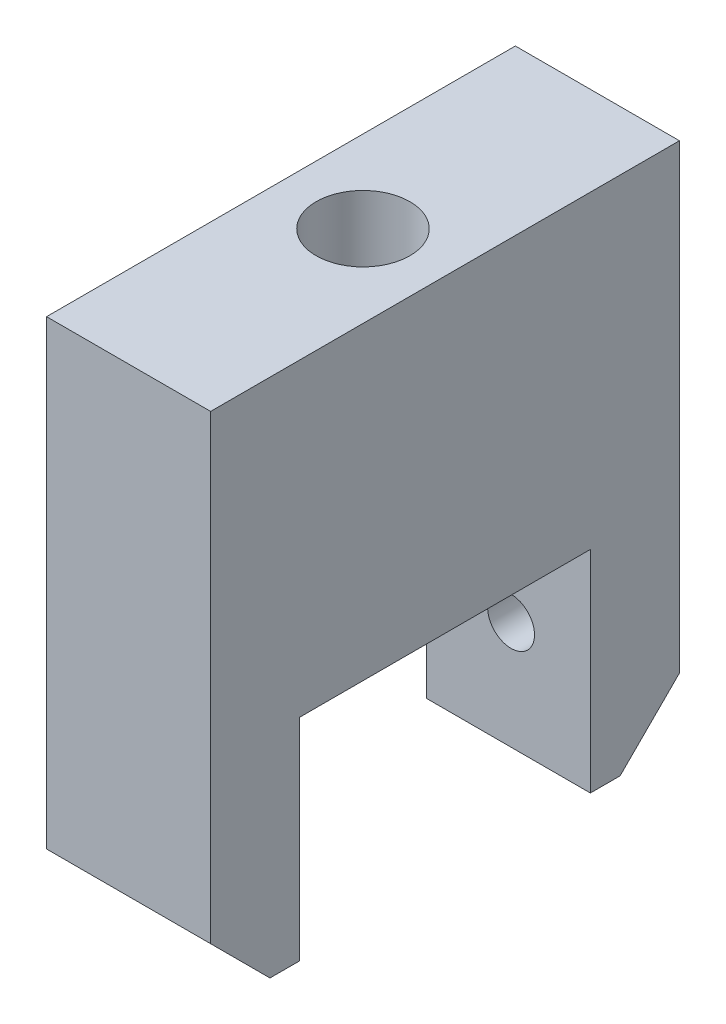
ISO-10303-21;
HEADER;
FILE_DESCRIPTION(('STEP AP214'),'2;1');
FILE_NAME('part.step','',(''),(''),'','','');
FILE_SCHEMA(('AUTOMOTIVE_DESIGN { 1 0 10303 214 1 1 1 1 }'));
ENDSEC;
DATA;
#1=APPLICATION_CONTEXT('core data for automotive mechanical design processes');
#2=APPLICATION_PROTOCOL_DEFINITION('international standard','automotive_design',2000,#1);
#3=PRODUCT_CONTEXT('',#1,'mechanical');
#4=PRODUCT('Part','Part','',(#3));
#5=PRODUCT_RELATED_PRODUCT_CATEGORY('part','',(#4));
#6=PRODUCT_DEFINITION_FORMATION('','',#4);
#7=PRODUCT_DEFINITION_CONTEXT('part definition',#1,'design');
#8=PRODUCT_DEFINITION('design','',#6,#7);
#9=PRODUCT_DEFINITION_SHAPE('','',#8);
#10=(LENGTH_UNIT() NAMED_UNIT(*) SI_UNIT(.MILLI.,.METRE.));
#11=(NAMED_UNIT(*) PLANE_ANGLE_UNIT() SI_UNIT($,.RADIAN.));
#12=(NAMED_UNIT(*) SI_UNIT($,.STERADIAN.) SOLID_ANGLE_UNIT());
#13=UNCERTAINTY_MEASURE_WITH_UNIT(LENGTH_MEASURE(1.E-05),#10,'distance_accuracy_value','');
#14=(GEOMETRIC_REPRESENTATION_CONTEXT(3) GLOBAL_UNCERTAINTY_ASSIGNED_CONTEXT((#13)) GLOBAL_UNIT_ASSIGNED_CONTEXT((#10,
#11,#12)) REPRESENTATION_CONTEXT('',''));
#15=CARTESIAN_POINT('',(0.,0.,0.));
#16=DIRECTION('',(0.,0.,1.));
#17=DIRECTION('',(1.,0.,0.));
#18=AXIS2_PLACEMENT_3D('',#15,#16,#17);
#19=CARTESIAN_POINT('',(5.461,0.508,0.));
#20=DIRECTION('',(0.,1.,0.));
#21=DIRECTION('',(0.,0.,1.));
#22=AXIS2_PLACEMENT_3D('',#19,#20,#21);
#23=PLANE('',#22);
#24=DIRECTION('',(1.,0.,0.));
#25=VECTOR('',#24,1.);
#26=CARTESIAN_POINT('',(4.95299999999999,0.508,-10.795));
#27=LINE('',#26,#25);
#28=CARTESIAN_POINT('',(0.507999999999993,0.508,-10.795));
#29=VERTEX_POINT('',#28);
#30=CARTESIAN_POINT('',(4.95299999999999,0.508,-10.795));
#31=VERTEX_POINT('',#30);
#32=EDGE_CURVE('E201',#29,#31,#27,.T.);
#33=ORIENTED_EDGE('',*,*,#32,.F.);
#34=DIRECTION('',(0.,0.,-1.));
#35=VECTOR('',#34,1.);
#36=CARTESIAN_POINT('',(0.508,0.508,0.));
#37=LINE('',#36,#35);
#38=CARTESIAN_POINT('',(0.507999999999991,0.508,-11.6005795103145));
#39=VERTEX_POINT('',#38);
#40=EDGE_CURVE('E170',#29,#39,#37,.T.);
#41=ORIENTED_EDGE('',*,*,#40,.T.);
#42=DIRECTION('',(-1.,0.,0.));
#43=VECTOR('',#42,1.);
#44=CARTESIAN_POINT('',(5.46099999999999,0.508,-11.6005795103145));
#45=LINE('',#44,#43);
#46=CARTESIAN_POINT('',(4.95299999999999,0.508,-11.6005795103145));
#47=VERTEX_POINT('',#46);
#48=EDGE_CURVE('E234',#39,#47,#45,.F.);
#49=ORIENTED_EDGE('',*,*,#48,.T.);
#50=DIRECTION('',(0.,0.,-1.));
#51=VECTOR('',#50,1.);
#52=CARTESIAN_POINT('',(4.953,0.508,0.));
#53=LINE('',#52,#51);
#54=EDGE_CURVE('E185',#31,#47,#53,.T.);
#55=ORIENTED_EDGE('',*,*,#54,.F.);
#56=EDGE_LOOP('',(#33,#41,#49,#55));
#57=FACE_BOUND('',#56,.T.);
#58=ADVANCED_FACE('F45',(#57),#23,.F.);
#59=CARTESIAN_POINT('',(4.95299999999999,5.715,-10.795));
#60=DIRECTION('',(0.,0.,-1.));
#61=DIRECTION('',(0.,1.,0.));
#62=AXIS2_PLACEMENT_3D('',#59,#60,#61);
#63=PLANE('',#62);
#64=CARTESIAN_POINT('',(2.80519333101496,3.46153428273353,-10.795));
#65=DIRECTION('',(0.,0.,-1.));
#66=DIRECTION('',(-1.,0.,0.));
#67=AXIS2_PLACEMENT_3D('',#64,#65,#66);
#68=CIRCLE('',#67,0.635);
#69=CARTESIAN_POINT('',(2.17019333101496,3.46153428273353,-10.795));
#70=VERTEX_POINT('',#69);
#71=EDGE_CURVE('E171',#70,#70,#68,.T.);
#72=ORIENTED_EDGE('',*,*,#71,.T.);
#73=EDGE_LOOP('',(#72));
#74=FACE_BOUND('',#73,.T.);
#75=DIRECTION('',(0.,-1.,0.));
#76=VECTOR('',#75,1.);
#77=CARTESIAN_POINT('',(4.95299999999999,5.715,-10.795));
#78=LINE('',#77,#76);
#79=CARTESIAN_POINT('',(4.95299999999999,6.223,-10.795));
#80=VERTEX_POINT('',#79);
#81=EDGE_CURVE('E182',#80,#31,#78,.T.);
#82=ORIENTED_EDGE('',*,*,#81,.F.);
#83=DIRECTION('',(1.,0.,0.));
#84=VECTOR('',#83,1.);
#85=CARTESIAN_POINT('',(0.,6.223,-10.795));
#86=LINE('',#85,#84);
#87=CARTESIAN_POINT('',(0.507999999999993,6.223,-10.795));
#88=VERTEX_POINT('',#87);
#89=EDGE_CURVE('E176',#88,#80,#86,.T.);
#90=ORIENTED_EDGE('',*,*,#89,.F.);
#91=DIRECTION('',(0.,1.,0.));
#92=VECTOR('',#91,1.);
#93=CARTESIAN_POINT('',(0.507999999999993,0.,-10.795));
#94=LINE('',#93,#92);
#95=EDGE_CURVE('E187',#29,#88,#94,.T.);
#96=ORIENTED_EDGE('',*,*,#95,.F.);
#97=ORIENTED_EDGE('',*,*,#32,.T.);
#98=EDGE_LOOP('',(#82,#90,#96,#97));
#99=FACE_BOUND('',#98,.T.);
#100=ADVANCED_FACE('F246',(#74,#99),#63,.F.);
#101=CARTESIAN_POINT('',(0.,6.223,0.));
#102=DIRECTION('',(0.,-1.,0.));
#103=DIRECTION('',(0.,0.,-1.));
#104=AXIS2_PLACEMENT_3D('',#101,#102,#103);
#105=PLANE('',#104);
#106=CARTESIAN_POINT('',(2.7305,6.223,-6.858));
#107=DIRECTION('',(0.,-1.,0.));
#108=DIRECTION('',(0.,0.,-1.));
#109=AXIS2_PLACEMENT_3D('',#106,#107,#108);
#110=CIRCLE('',#109,1.27);
#111=CARTESIAN_POINT('',(2.7305,6.223,-8.128));
#112=VERTEX_POINT('',#111);
#113=EDGE_CURVE('E166',#112,#112,#110,.T.);
#114=ORIENTED_EDGE('',*,*,#113,.F.);
#115=EDGE_LOOP('',(#114));
#116=FACE_BOUND('',#115,.T.);
#117=DIRECTION('',(0.,0.,1.));
#118=VECTOR('',#117,1.);
#119=CARTESIAN_POINT('',(4.953,6.223,0.));
#120=LINE('',#119,#118);
#121=CARTESIAN_POINT('',(4.953,6.223,-2.92100000000001));
#122=VERTEX_POINT('',#121);
#123=EDGE_CURVE('E172',#80,#122,#120,.T.);
#124=ORIENTED_EDGE('',*,*,#123,.T.);
#125=DIRECTION('',(-1.,0.,0.));
#126=VECTOR('',#125,1.);
#127=CARTESIAN_POINT('',(0.,6.223,-2.921));
#128=LINE('',#127,#126);
#129=CARTESIAN_POINT('',(0.507999999999998,6.223,-2.921));
#130=VERTEX_POINT('',#129);
#131=EDGE_CURVE('E175',#122,#130,#128,.T.);
#132=ORIENTED_EDGE('',*,*,#131,.T.);
#133=DIRECTION('',(0.,0.,-1.));
#134=VECTOR('',#133,1.);
#135=CARTESIAN_POINT('',(0.508,6.223,0.));
#136=LINE('',#135,#134);
#137=EDGE_CURVE('E177',#130,#88,#136,.T.);
#138=ORIENTED_EDGE('',*,*,#137,.T.);
#139=ORIENTED_EDGE('',*,*,#89,.T.);
#140=EDGE_LOOP('',(#124,#132,#138,#139));
#141=FACE_BOUND('',#140,.T.);
#142=ADVANCED_FACE('F304',(#116,#141),#105,.T.);
#143=CARTESIAN_POINT('',(4.953,5.715,-2.92100000000001));
#144=DIRECTION('',(0.,0.,1.));
#145=DIRECTION('',(-1.,0.,0.));
#146=AXIS2_PLACEMENT_3D('',#143,#144,#145);
#147=PLANE('',#146);
#148=CARTESIAN_POINT('',(2.80519333101497,3.46153428273353,-2.921));
#149=DIRECTION('',(0.,0.,1.));
#150=DIRECTION('',(1.,0.,0.));
#151=AXIS2_PLACEMENT_3D('',#148,#149,#150);
#152=CIRCLE('',#151,0.635);
#153=CARTESIAN_POINT('',(3.44019333101497,3.46153428273353,-2.92100000000001));
#154=VERTEX_POINT('',#153);
#155=EDGE_CURVE('E272',#154,#154,#152,.T.);
#156=ORIENTED_EDGE('',*,*,#155,.T.);
#157=EDGE_LOOP('',(#156));
#158=FACE_BOUND('',#157,.T.);
#159=ORIENTED_EDGE('',*,*,#131,.F.);
#160=DIRECTION('',(0.,-1.,0.));
#161=VECTOR('',#160,1.);
#162=CARTESIAN_POINT('',(4.953,0.,-2.92100000000001));
#163=LINE('',#162,#161);
#164=CARTESIAN_POINT('',(4.953,0.508,-2.92100000000001));
#165=VERTEX_POINT('',#164);
#166=EDGE_CURVE('E181',#122,#165,#163,.T.);
#167=ORIENTED_EDGE('',*,*,#166,.T.);
#168=DIRECTION('',(-1.,0.,0.));
#169=VECTOR('',#168,1.);
#170=CARTESIAN_POINT('',(4.953,0.508,-2.92100000000001));
#171=LINE('',#170,#169);
#172=CARTESIAN_POINT('',(0.507999999999998,0.508,-2.921));
#173=VERTEX_POINT('',#172);
#174=EDGE_CURVE('E48',#165,#173,#171,.T.);
#175=ORIENTED_EDGE('',*,*,#174,.T.);
#176=DIRECTION('',(0.,1.,0.));
#177=VECTOR('',#176,1.);
#178=CARTESIAN_POINT('',(0.507999999999998,5.715,-2.921));
#179=LINE('',#178,#177);
#180=EDGE_CURVE('E193',#173,#130,#179,.T.);
#181=ORIENTED_EDGE('',*,*,#180,.T.);
#182=EDGE_LOOP('',(#159,#167,#175,#181));
#183=FACE_BOUND('',#182,.T.);
#184=ADVANCED_FACE('F307',(#158,#183),#147,.F.);
#185=CARTESIAN_POINT('',(0.508,0.508,-2.11542048968553));
#186=VERTEX_POINT('',#185);
#187=EDGE_CURVE('E197',#186,#173,#37,.T.);
#188=ORIENTED_EDGE('',*,*,#187,.T.);
#189=ORIENTED_EDGE('',*,*,#174,.F.);
#190=CARTESIAN_POINT('',(4.953,0.508,-2.11542048968554));
#191=VERTEX_POINT('',#190);
#192=EDGE_CURVE('E186',#191,#165,#53,.T.);
#193=ORIENTED_EDGE('',*,*,#192,.F.);
#194=DIRECTION('',(1.,0.,0.));
#195=VECTOR('',#194,1.);
#196=CARTESIAN_POINT('',(5.461,0.508,-2.11542048968554));
#197=LINE('',#196,#195);
#198=EDGE_CURVE('E211',#191,#186,#197,.F.);
#199=ORIENTED_EDGE('',*,*,#198,.T.);
#200=EDGE_LOOP('',(#188,#189,#193,#199));
#201=FACE_BOUND('',#200,.T.);
#202=ADVANCED_FACE('F300',(#201),#23,.F.);
#203=CARTESIAN_POINT('',(5.46099999999999,2.26421024484277,-13.3567897551572));
#204=DIRECTION('',(0.,0.707106781186549,0.707106781186546));
#205=DIRECTION('',(-1.,0.,0.));
#206=AXIS2_PLACEMENT_3D('',#203,#204,#205);
#207=PLANE('',#206);
#208=DIRECTION('',(0.,-0.707106781186546,0.707106781186549));
#209=VECTOR('',#208,1.);
#210=CARTESIAN_POINT('',(4.953,-5.54628975515723,-5.54628975515721));
#211=LINE('',#210,#209);
#212=CARTESIAN_POINT('',(4.95299999999999,2.11542048968553,-13.208));
#213=VERTEX_POINT('',#212);
#214=EDGE_CURVE('E65',#47,#213,#211,.F.);
#215=ORIENTED_EDGE('',*,*,#214,.F.);
#216=ORIENTED_EDGE('',*,*,#48,.F.);
#217=DIRECTION('',(0.,0.707106781186546,-0.707106781186549));
#218=VECTOR('',#217,1.);
#219=CARTESIAN_POINT('',(0.507999999999991,2.26421024484277,-13.3567897551572));
#220=LINE('',#219,#218);
#221=CARTESIAN_POINT('',(0.507999999999991,2.11542048968553,-13.208));
#222=VERTEX_POINT('',#221);
#223=EDGE_CURVE('E190',#222,#39,#220,.F.);
#224=ORIENTED_EDGE('',*,*,#223,.F.);
#225=DIRECTION('',(1.,0.,0.));
#226=VECTOR('',#225,1.);
#227=CARTESIAN_POINT('',(5.46099999999999,2.11542048968553,-13.208));
#228=LINE('',#227,#226);
#229=EDGE_CURVE('E207',#213,#222,#228,.F.);
#230=ORIENTED_EDGE('',*,*,#229,.F.);
#231=EDGE_LOOP('',(#215,#216,#224,#230));
#232=FACE_BOUND('',#231,.T.);
#233=ADVANCED_FACE('F253',(#232),#207,.F.);
#234=CARTESIAN_POINT('',(5.461,0.359210244842766,-2.26421024484277));
#235=DIRECTION('',(0.,0.707106781186547,-0.707106781186548));
#236=DIRECTION('',(-1.,0.,0.));
#237=AXIS2_PLACEMENT_3D('',#234,#235,#236);
#238=PLANE('',#237);
#239=DIRECTION('',(0.,0.707106781186548,0.707106781186547));
#240=VECTOR('',#239,1.);
#241=CARTESIAN_POINT('',(4.953,1.31171024484277,-1.31171024484277));
#242=LINE('',#241,#240);
#243=CARTESIAN_POINT('',(4.953,2.11542048968554,-0.508000000000003));
#244=VERTEX_POINT('',#243);
#245=EDGE_CURVE('E143',#244,#191,#242,.F.);
#246=ORIENTED_EDGE('',*,*,#245,.F.);
#247=DIRECTION('',(-1.,0.,0.));
#248=VECTOR('',#247,1.);
#249=CARTESIAN_POINT('',(5.461,2.11542048968554,-0.508000000000003));
#250=LINE('',#249,#248);
#251=CARTESIAN_POINT('',(0.508,2.11542048968554,-0.507999999999999));
#252=VERTEX_POINT('',#251);
#253=EDGE_CURVE('E139',#252,#244,#250,.F.);
#254=ORIENTED_EDGE('',*,*,#253,.F.);
#255=DIRECTION('',(0.,-0.707106781186548,-0.707106781186547));
#256=VECTOR('',#255,1.);
#257=CARTESIAN_POINT('',(0.508,0.359210244842766,-2.26421024484277));
#258=LINE('',#257,#256);
#259=EDGE_CURVE('E152',#186,#252,#258,.F.);
#260=ORIENTED_EDGE('',*,*,#259,.F.);
#261=ORIENTED_EDGE('',*,*,#198,.F.);
#262=EDGE_LOOP('',(#246,#254,#260,#261));
#263=FACE_BOUND('',#262,.T.);
#264=ADVANCED_FACE('F313',(#263),#238,.F.);
#265=CARTESIAN_POINT('',(5.461,0.,-0.508000000000003));
#266=DIRECTION('',(0.,0.,-1.));
#267=DIRECTION('',(0.,1.,0.));
#268=AXIS2_PLACEMENT_3D('',#265,#266,#267);
#269=PLANE('',#268);
#270=DIRECTION('',(0.,-1.,0.));
#271=VECTOR('',#270,1.);
#272=CARTESIAN_POINT('',(0.508,0.,-0.507999999999999));
#273=LINE('',#272,#271);
#274=CARTESIAN_POINT('',(0.508,14.605,-0.507999999999998));
#275=VERTEX_POINT('',#274);
#276=EDGE_CURVE('E208',#275,#252,#273,.T.);
#277=ORIENTED_EDGE('',*,*,#276,.T.);
#278=ORIENTED_EDGE('',*,*,#253,.T.);
#279=DIRECTION('',(0.,-1.,0.));
#280=VECTOR('',#279,1.);
#281=CARTESIAN_POINT('',(4.953,0.,-0.508000000000003));
#282=LINE('',#281,#280);
#283=CARTESIAN_POINT('',(4.953,14.605,-0.508000000000001));
#284=VERTEX_POINT('',#283);
#285=EDGE_CURVE('E134',#284,#244,#282,.T.);
#286=ORIENTED_EDGE('',*,*,#285,.F.);
#287=DIRECTION('',(1.,0.,0.));
#288=VECTOR('',#287,1.);
#289=CARTESIAN_POINT('',(0.,14.605,-0.507999999999997));
#290=LINE('',#289,#288);
#291=EDGE_CURVE('E12',#275,#284,#290,.T.);
#292=ORIENTED_EDGE('',*,*,#291,.F.);
#293=EDGE_LOOP('',(#277,#278,#286,#292));
#294=FACE_BOUND('',#293,.T.);
#295=ADVANCED_FACE('F136',(#294),#269,.F.);
#296=CARTESIAN_POINT('',(5.46099999999999,0.,-13.208));
#297=DIRECTION('',(0.,0.,1.));
#298=DIRECTION('',(0.,-1.,0.));
#299=AXIS2_PLACEMENT_3D('',#296,#297,#298);
#300=PLANE('',#299);
#301=DIRECTION('',(0.,1.,0.));
#302=VECTOR('',#301,1.);
#303=CARTESIAN_POINT('',(4.95299999999999,0.,-13.208));
#304=LINE('',#303,#302);
#305=CARTESIAN_POINT('',(4.95299999999999,14.605,-13.208));
#306=VERTEX_POINT('',#305);
#307=EDGE_CURVE('E148',#213,#306,#304,.T.);
#308=ORIENTED_EDGE('',*,*,#307,.F.);
#309=ORIENTED_EDGE('',*,*,#229,.T.);
#310=DIRECTION('',(0.,1.,0.));
#311=VECTOR('',#310,1.);
#312=CARTESIAN_POINT('',(0.507999999999991,0.,-13.208));
#313=LINE('',#312,#311);
#314=CARTESIAN_POINT('',(0.507999999999991,14.605,-13.208));
#315=VERTEX_POINT('',#314);
#316=EDGE_CURVE('E218',#222,#315,#313,.T.);
#317=ORIENTED_EDGE('',*,*,#316,.T.);
#318=DIRECTION('',(-1.,0.,0.));
#319=VECTOR('',#318,1.);
#320=CARTESIAN_POINT('',(0.,14.605,-13.208));
#321=LINE('',#320,#319);
#322=EDGE_CURVE('E156',#306,#315,#321,.T.);
#323=ORIENTED_EDGE('',*,*,#322,.F.);
#324=EDGE_LOOP('',(#308,#309,#317,#323));
#325=FACE_BOUND('',#324,.T.);
#326=ADVANCED_FACE('F255',(#325),#300,.F.);
#327=CARTESIAN_POINT('',(0.508,0.,0.));
#328=DIRECTION('',(1.,0.,0.));
#329=DIRECTION('',(0.,0.,1.));
#330=AXIS2_PLACEMENT_3D('',#327,#328,#329);
#331=PLANE('',#330);
#332=ORIENTED_EDGE('',*,*,#316,.F.);
#333=ORIENTED_EDGE('',*,*,#223,.T.);
#334=ORIENTED_EDGE('',*,*,#40,.F.);
#335=ORIENTED_EDGE('',*,*,#95,.T.);
#336=ORIENTED_EDGE('',*,*,#137,.F.);
#337=ORIENTED_EDGE('',*,*,#180,.F.);
#338=ORIENTED_EDGE('',*,*,#187,.F.);
#339=ORIENTED_EDGE('',*,*,#259,.T.);
#340=ORIENTED_EDGE('',*,*,#276,.F.);
#341=DIRECTION('',(0.,0.,1.));
#342=VECTOR('',#341,1.);
#343=CARTESIAN_POINT('',(0.508,14.605,0.));
#344=LINE('',#343,#342);
#345=EDGE_CURVE('E54',#315,#275,#344,.T.);
#346=ORIENTED_EDGE('',*,*,#345,.F.);
#347=EDGE_LOOP('',(#332,#333,#334,#335,#336,#337,#338,#339,#340,#346));
#348=FACE_BOUND('',#347,.T.);
#349=ADVANCED_FACE('F256',(#348),#331,.F.);
#350=CARTESIAN_POINT('',(4.953,0.,0.));
#351=DIRECTION('',(1.,0.,0.));
#352=DIRECTION('',(0.,0.,1.));
#353=AXIS2_PLACEMENT_3D('',#350,#351,#352);
#354=PLANE('',#353);
#355=DIRECTION('',(0.,0.,1.));
#356=VECTOR('',#355,1.);
#357=CARTESIAN_POINT('',(4.953,14.605,0.));
#358=LINE('',#357,#356);
#359=EDGE_CURVE('E144',#306,#284,#358,.T.);
#360=ORIENTED_EDGE('',*,*,#359,.T.);
#361=ORIENTED_EDGE('',*,*,#285,.T.);
#362=ORIENTED_EDGE('',*,*,#245,.T.);
#363=ORIENTED_EDGE('',*,*,#192,.T.);
#364=ORIENTED_EDGE('',*,*,#166,.F.);
#365=ORIENTED_EDGE('',*,*,#123,.F.);
#366=ORIENTED_EDGE('',*,*,#81,.T.);
#367=ORIENTED_EDGE('',*,*,#54,.T.);
#368=ORIENTED_EDGE('',*,*,#214,.T.);
#369=ORIENTED_EDGE('',*,*,#307,.T.);
#370=EDGE_LOOP('',(#360,#361,#362,#363,#364,#365,#366,#367,#368,#369));
#371=FACE_BOUND('',#370,.T.);
#372=ADVANCED_FACE('F147',(#371),#354,.T.);
#373=CARTESIAN_POINT('',(0.,14.605,0.));
#374=DIRECTION('',(0.,-1.,0.));
#375=DIRECTION('',(0.,0.,-1.));
#376=AXIS2_PLACEMENT_3D('',#373,#374,#375);
#377=PLANE('',#376);
#378=CARTESIAN_POINT('',(2.7305,14.605,-6.858));
#379=DIRECTION('',(0.,-1.,0.));
#380=DIRECTION('',(0.,0.,-1.));
#381=AXIS2_PLACEMENT_3D('',#378,#379,#380);
#382=CIRCLE('',#381,1.27);
#383=CARTESIAN_POINT('',(2.7305,14.605,-8.128));
#384=VERTEX_POINT('',#383);
#385=EDGE_CURVE('E258',#384,#384,#382,.T.);
#386=ORIENTED_EDGE('',*,*,#385,.T.);
#387=EDGE_LOOP('',(#386));
#388=FACE_BOUND('',#387,.T.);
#389=ORIENTED_EDGE('',*,*,#359,.F.);
#390=ORIENTED_EDGE('',*,*,#322,.T.);
#391=ORIENTED_EDGE('',*,*,#345,.T.);
#392=ORIENTED_EDGE('',*,*,#291,.T.);
#393=EDGE_LOOP('',(#389,#390,#391,#392));
#394=FACE_BOUND('',#393,.T.);
#395=ADVANCED_FACE('F155',(#388,#394),#377,.F.);
#396=CARTESIAN_POINT('',(5.461,0.,-0.660400000000003));
#397=DIRECTION('',(0.,0.,-1.));
#398=DIRECTION('',(0.,1.,0.));
#399=AXIS2_PLACEMENT_3D('',#396,#397,#398);
#400=PLANE('',#399);
#401=CARTESIAN_POINT('',(2.80519333101497,3.46153428273353,-0.660400000000001));
#402=DIRECTION('',(0.,0.,-1.));
#403=DIRECTION('',(-1.,0.,0.));
#404=AXIS2_PLACEMENT_3D('',#401,#402,#403);
#405=CIRCLE('',#404,0.635);
#406=CARTESIAN_POINT('',(2.17019333101497,3.46153428273353,-0.6604));
#407=VERTEX_POINT('',#406);
#408=EDGE_CURVE('E266',#407,#407,#405,.F.);
#409=ORIENTED_EDGE('',*,*,#408,.F.);
#410=EDGE_LOOP('',(#409));
#411=FACE_BOUND('',#410,.T.);
#412=ADVANCED_FACE('F294',(#411),#400,.T.);
#413=CARTESIAN_POINT('',(2.80519333101497,3.46153428273353,1.28805122421383));
#414=DIRECTION('',(0.,0.,-1.));
#415=DIRECTION('',(-1.,0.,0.));
#416=AXIS2_PLACEMENT_3D('',#413,#414,#415);
#417=CYLINDRICAL_SURFACE('',#416,0.635);
#418=ORIENTED_EDGE('',*,*,#408,.T.);
#419=EDGE_LOOP('',(#418));
#420=FACE_BOUND('',#419,.T.);
#421=ORIENTED_EDGE('',*,*,#155,.F.);
#422=EDGE_LOOP('',(#421));
#423=FACE_BOUND('',#422,.T.);
#424=ADVANCED_FACE('F284',(#420,#423),#417,.F.);
#425=CARTESIAN_POINT('',(2.80519333101496,3.46153428273353,-13.0556));
#426=DIRECTION('',(0.,0.,1.));
#427=DIRECTION('',(1.,0.,0.));
#428=AXIS2_PLACEMENT_3D('',#425,#426,#427);
#429=CIRCLE('',#428,0.635);
#430=CARTESIAN_POINT('',(3.44019333101496,3.46153428273353,-13.0556));
#431=VERTEX_POINT('',#430);
#432=EDGE_CURVE('E260',#431,#431,#429,.T.);
#433=ORIENTED_EDGE('',*,*,#432,.F.);
#434=EDGE_LOOP('',(#433));
#435=FACE_BOUND('',#434,.T.);
#436=ORIENTED_EDGE('',*,*,#71,.F.);
#437=EDGE_LOOP('',(#436));
#438=FACE_BOUND('',#437,.T.);
#439=ADVANCED_FACE('F281',(#435,#438),#417,.F.);
#440=CARTESIAN_POINT('',(5.46099999999999,0.,-13.0556));
#441=DIRECTION('',(0.,0.,1.));
#442=DIRECTION('',(0.,-1.,0.));
#443=AXIS2_PLACEMENT_3D('',#440,#441,#442);
#444=PLANE('',#443);
#445=ORIENTED_EDGE('',*,*,#432,.T.);
#446=EDGE_LOOP('',(#445));
#447=FACE_BOUND('',#446,.T.);
#448=ADVANCED_FACE('F283',(#447),#444,.T.);
#449=CARTESIAN_POINT('',(2.7305,14.605,-6.858));
#450=DIRECTION('',(0.,-1.,0.));
#451=DIRECTION('',(0.,0.,-1.));
#452=AXIS2_PLACEMENT_3D('',#449,#450,#451);
#453=CYLINDRICAL_SURFACE('',#452,1.27);
#454=CARTESIAN_POINT('',(2.7305,6.223,-8.128));
#455=CARTESIAN_POINT('',(2.7305,6.3103125,-8.128));
#456=CARTESIAN_POINT('',(2.7305,6.397625,-8.128));
#457=CARTESIAN_POINT('',(2.7305,6.57225,-8.128));
#458=CARTESIAN_POINT('',(2.7305,6.6595625,-8.128));
#459=CARTESIAN_POINT('',(2.7305,6.8341875,-8.128));
#460=CARTESIAN_POINT('',(2.7305,6.9215,-8.128));
#461=CARTESIAN_POINT('',(2.7305,7.096125,-8.128));
#462=CARTESIAN_POINT('',(2.7305,7.1834375,-8.128));
#463=CARTESIAN_POINT('',(2.7305,7.3580625,-8.128));
#464=CARTESIAN_POINT('',(2.7305,7.445375,-8.128));
#465=CARTESIAN_POINT('',(2.7305,7.62,-8.128));
#466=CARTESIAN_POINT('',(2.7305,7.7073125,-8.128));
#467=CARTESIAN_POINT('',(2.7305,7.8819375,-8.128));
#468=CARTESIAN_POINT('',(2.7305,7.96925,-8.128));
#469=CARTESIAN_POINT('',(2.7305,8.143875,-8.128));
#470=CARTESIAN_POINT('',(2.7305,8.2311875,-8.128));
#471=CARTESIAN_POINT('',(2.7305,8.4058125,-8.128));
#472=CARTESIAN_POINT('',(2.7305,8.493125,-8.128));
#473=CARTESIAN_POINT('',(2.7305,8.66775,-8.128));
#474=CARTESIAN_POINT('',(2.7305,8.7550625,-8.128));
#475=CARTESIAN_POINT('',(2.7305,8.9296875,-8.128));
#476=CARTESIAN_POINT('',(2.7305,9.017,-8.128));
#477=CARTESIAN_POINT('',(2.7305,9.191625,-8.128));
#478=CARTESIAN_POINT('',(2.7305,9.2789375,-8.128));
#479=CARTESIAN_POINT('',(2.7305,9.4535625,-8.128));
#480=CARTESIAN_POINT('',(2.7305,9.540875,-8.128));
#481=CARTESIAN_POINT('',(2.7305,9.7155,-8.128));
#482=CARTESIAN_POINT('',(2.7305,9.8028125,-8.128));
#483=CARTESIAN_POINT('',(2.7305,9.9774375,-8.128));
#484=CARTESIAN_POINT('',(2.7305,10.06475,-8.128));
#485=CARTESIAN_POINT('',(2.7305,10.239375,-8.128));
#486=CARTESIAN_POINT('',(2.7305,10.3266875,-8.128));
#487=CARTESIAN_POINT('',(2.7305,10.5013125,-8.128));
#488=CARTESIAN_POINT('',(2.7305,10.588625,-8.128));
#489=CARTESIAN_POINT('',(2.7305,10.76325,-8.128));
#490=CARTESIAN_POINT('',(2.7305,10.8505625,-8.128));
#491=CARTESIAN_POINT('',(2.7305,11.0251875,-8.128));
#492=CARTESIAN_POINT('',(2.7305,11.1125,-8.128));
#493=CARTESIAN_POINT('',(2.7305,11.287125,-8.128));
#494=CARTESIAN_POINT('',(2.7305,11.3744375,-8.128));
#495=CARTESIAN_POINT('',(2.7305,11.5490625,-8.128));
#496=CARTESIAN_POINT('',(2.7305,11.636375,-8.128));
#497=CARTESIAN_POINT('',(2.7305,11.811,-8.128));
#498=CARTESIAN_POINT('',(2.7305,11.8983125,-8.128));
#499=CARTESIAN_POINT('',(2.7305,12.0729375,-8.128));
#500=CARTESIAN_POINT('',(2.7305,12.16025,-8.128));
#501=CARTESIAN_POINT('',(2.7305,12.334875,-8.128));
#502=CARTESIAN_POINT('',(2.7305,12.4221875,-8.128));
#503=CARTESIAN_POINT('',(2.7305,12.5968125,-8.128));
#504=CARTESIAN_POINT('',(2.7305,12.684125,-8.128));
#505=CARTESIAN_POINT('',(2.7305,12.85875,-8.128));
#506=CARTESIAN_POINT('',(2.7305,12.9460625,-8.128));
#507=CARTESIAN_POINT('',(2.7305,13.1206875,-8.128));
#508=CARTESIAN_POINT('',(2.7305,13.208,-8.128));
#509=CARTESIAN_POINT('',(2.7305,13.382625,-8.128));
#510=CARTESIAN_POINT('',(2.7305,13.4699375,-8.128));
#511=CARTESIAN_POINT('',(2.7305,13.6445625,-8.128));
#512=CARTESIAN_POINT('',(2.7305,13.731875,-8.128));
#513=CARTESIAN_POINT('',(2.7305,13.9065,-8.128));
#514=CARTESIAN_POINT('',(2.7305,13.9938125,-8.128));
#515=CARTESIAN_POINT('',(2.7305,14.1684375,-8.128));
#516=CARTESIAN_POINT('',(2.7305,14.25575,-8.128));
#517=CARTESIAN_POINT('',(2.7305,14.430375,-8.128));
#518=CARTESIAN_POINT('',(2.7305,14.5176875,-8.128));
#519=CARTESIAN_POINT('',(2.7305,14.605,-8.128));
#520=B_SPLINE_CURVE_WITH_KNOTS('',3,(#454,#455,#456,#457,#458,#459,#460,#461,#462,#463,#464,
#465,#466,#467,#468,#469,#470,#471,#472,#473,#474,#475,#476,#477,#478,#479,#480,#481,#482,#483,
#484,#485,#486,#487,#488,#489,#490,#491,#492,#493,#494,#495,#496,#497,#498,#499,#500,#501,#502,
#503,#504,#505,#506,#507,#508,#509,#510,#511,#512,#513,#514,#515,#516,#517,#518,#519),
.UNSPECIFIED.,.F.,.F.,(4,2,2,2,2,2,2,2,2,2,2,2,2,2,2,2,2,2,2,2,2,2,2,2,2,2,2,2,2,2,2,2,4),(0.,
0.2619375,0.523875,0.785812499999999,1.04775,1.3096875,1.571625,1.8335625,2.0955,2.3574375,
2.619375,2.8813125,3.14325,3.4051875,3.667125,3.9290625,4.191,4.4529375,4.714875,4.9768125,
5.23875,5.5006875,5.762625,6.0245625,6.2865,6.5484375,6.810375,7.0723125,7.33425,7.5961875,
7.858125,8.1200625,8.382),.UNSPECIFIED.);
#521=EDGE_CURVE('BSEAM291',#112,#384,#520,.T.);
#522=ORIENTED_EDGE('',*,*,#113,.T.);
#523=ORIENTED_EDGE('',*,*,#385,.F.);
#524=ORIENTED_EDGE('',*,*,#521,.T.);
#525=ORIENTED_EDGE('',*,*,#521,.F.);
#526=EDGE_LOOP('',(#522,#524,#523,#525));
#527=FACE_BOUND('',#526,.T.);
#528=ADVANCED_FACE('F291',(#527),#453,.F.);
#529=CLOSED_SHELL('',(#58,#100,#142,#184,#202,#233,#264,#295,#326,#349,#372,#395,#412,#424,#439,
#448,#528));
#530=MANIFOLD_SOLID_BREP('B2',#529);
#531=ADVANCED_BREP_SHAPE_REPRESENTATION('',(#18,#530),#14);
#532=SHAPE_DEFINITION_REPRESENTATION(#9,#531);
ENDSEC;
END-ISO-10303-21;
